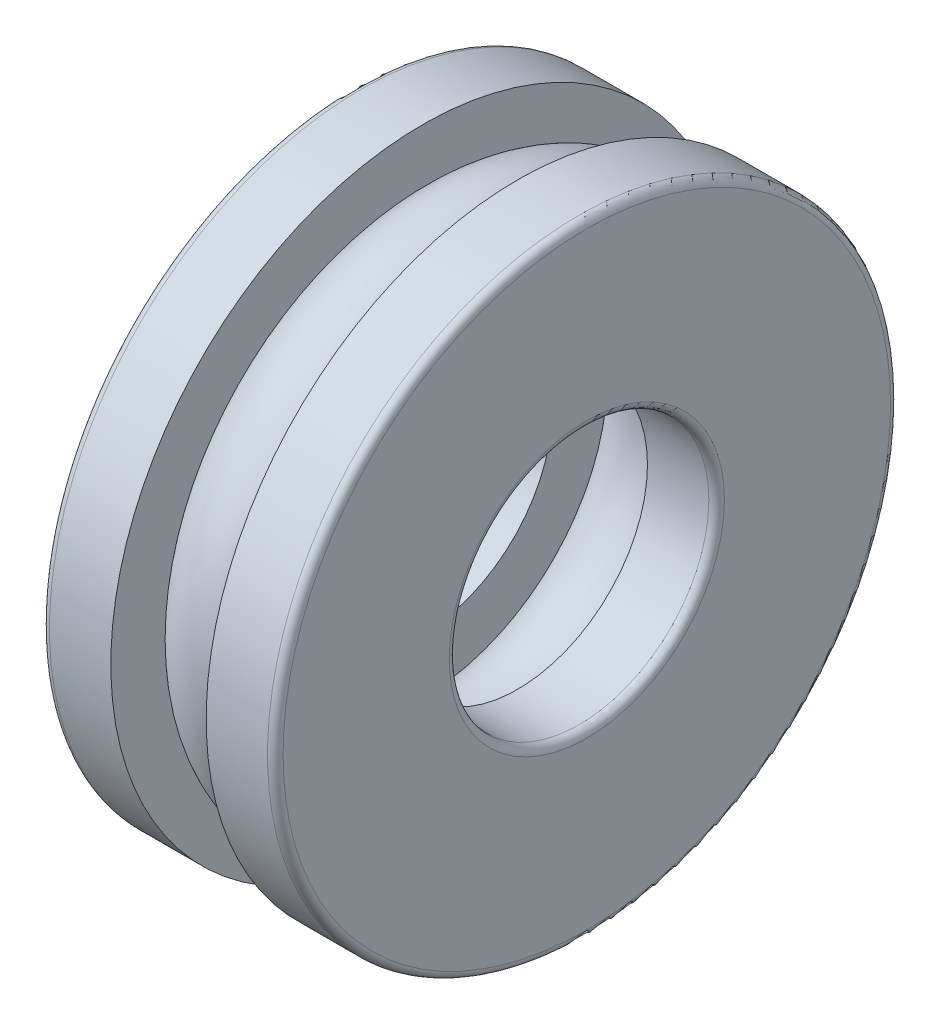
ISO-10303-21;
HEADER;
FILE_DESCRIPTION(('STEP AP214'),'2;1');
FILE_NAME('part.step','',(''),(''),'','','');
FILE_SCHEMA(('AUTOMOTIVE_DESIGN { 1 0 10303 214 1 1 1 1 }'));
ENDSEC;
DATA;
#1=APPLICATION_CONTEXT('core data for automotive mechanical design processes');
#2=APPLICATION_PROTOCOL_DEFINITION('international standard','automotive_design',2000,#1);
#3=PRODUCT_CONTEXT('',#1,'mechanical');
#4=PRODUCT('Part','Part','',(#3));
#5=PRODUCT_RELATED_PRODUCT_CATEGORY('part','',(#4));
#6=PRODUCT_DEFINITION_FORMATION('','',#4);
#7=PRODUCT_DEFINITION_CONTEXT('part definition',#1,'design');
#8=PRODUCT_DEFINITION('design','',#6,#7);
#9=PRODUCT_DEFINITION_SHAPE('','',#8);
#10=(LENGTH_UNIT() NAMED_UNIT(*) SI_UNIT(.MILLI.,.METRE.));
#11=(NAMED_UNIT(*) PLANE_ANGLE_UNIT() SI_UNIT($,.RADIAN.));
#12=(NAMED_UNIT(*) SI_UNIT($,.STERADIAN.) SOLID_ANGLE_UNIT());
#13=UNCERTAINTY_MEASURE_WITH_UNIT(LENGTH_MEASURE(1.E-05),#10,'distance_accuracy_value','');
#14=(GEOMETRIC_REPRESENTATION_CONTEXT(3) GLOBAL_UNCERTAINTY_ASSIGNED_CONTEXT((#13)) GLOBAL_UNIT_ASSIGNED_CONTEXT((#10,
#11,#12)) REPRESENTATION_CONTEXT('',''));
#15=CARTESIAN_POINT('',(0.,0.,0.));
#16=DIRECTION('',(0.,0.,1.));
#17=DIRECTION('',(1.,0.,0.));
#18=AXIS2_PLACEMENT_3D('',#15,#16,#17);
#19=CARTESIAN_POINT('',(0.,0.,0.));
#20=DIRECTION('',(-1.,0.,0.));
#21=DIRECTION('',(0.,0.,1.));
#22=AXIS2_PLACEMENT_3D('',#19,#20,#21);
#23=TOROIDAL_SURFACE('',#22,8.5,2.295);
#24=CARTESIAN_POINT('',(1.836,0.,0.));
#25=DIRECTION('',(-1.,0.,0.));
#26=DIRECTION('',(0.,0.,1.));
#27=AXIS2_PLACEMENT_3D('',#24,#25,#26);
#28=CIRCLE('',#27,9.877);
#29=CARTESIAN_POINT('',(1.836,0.,9.877));
#30=VERTEX_POINT('',#29);
#31=EDGE_CURVE('E35',#30,#30,#28,.T.);
#32=ORIENTED_EDGE('',*,*,#31,.T.);
#33=EDGE_LOOP('',(#32));
#34=FACE_BOUND('',#33,.T.);
#35=CARTESIAN_POINT('',(-1.836,0.,0.));
#36=DIRECTION('',(1.,0.,0.));
#37=DIRECTION('',(0.,0.,-1.));
#38=AXIS2_PLACEMENT_3D('',#35,#36,#37);
#39=CIRCLE('',#38,9.877);
#40=CARTESIAN_POINT('',(-1.836,0.,-9.877));
#41=VERTEX_POINT('',#40);
#42=EDGE_CURVE('E50',#41,#41,#39,.F.);
#43=ORIENTED_EDGE('',*,*,#42,.F.);
#44=EDGE_LOOP('',(#43));
#45=FACE_BOUND('',#44,.T.);
#46=ADVANCED_FACE('F31',(#34,#45),#23,.T.);
#47=CARTESIAN_POINT('',(-1.836,7.16508277410171,0.));
#48=DIRECTION('',(1.,0.,0.));
#49=DIRECTION('',(0.,0.,-1.));
#50=AXIS2_PLACEMENT_3D('',#47,#48,#49);
#51=PLANE('',#50);
#52=CARTESIAN_POINT('',(-1.836,0.,0.));
#53=DIRECTION('',(1.,0.,0.));
#54=DIRECTION('',(0.,0.,-1.));
#55=AXIS2_PLACEMENT_3D('',#52,#53,#54);
#56=CIRCLE('',#55,5.);
#57=CARTESIAN_POINT('',(-1.836,0.,-5.));
#58=VERTEX_POINT('',#57);
#59=EDGE_CURVE('E69',#58,#58,#56,.T.);
#60=ORIENTED_EDGE('',*,*,#59,.F.);
#61=EDGE_LOOP('',(#60));
#62=FACE_BOUND('',#61,.T.);
#63=CARTESIAN_POINT('',(-1.836,0.,0.));
#64=DIRECTION('',(-1.,0.,0.));
#65=DIRECTION('',(0.,0.,1.));
#66=AXIS2_PLACEMENT_3D('',#63,#64,#65);
#67=CIRCLE('',#66,7.123);
#68=CARTESIAN_POINT('',(-1.836,0.,7.123));
#69=VERTEX_POINT('',#68);
#70=EDGE_CURVE('E48',#69,#69,#67,.F.);
#71=ORIENTED_EDGE('',*,*,#70,.T.);
#72=EDGE_LOOP('',(#71));
#73=FACE_BOUND('',#72,.T.);
#74=ADVANCED_FACE('F98',(#62,#73),#51,.T.);
#75=CARTESIAN_POINT('',(-1.836,12.,0.));
#76=DIRECTION('',(1.,0.,0.));
#77=DIRECTION('',(0.,0.,-1.));
#78=AXIS2_PLACEMENT_3D('',#75,#76,#77);
#79=PLANE('',#78);
#80=ORIENTED_EDGE('',*,*,#42,.T.);
#81=EDGE_LOOP('',(#80));
#82=FACE_BOUND('',#81,.T.);
#83=CARTESIAN_POINT('',(-1.836,0.,0.));
#84=DIRECTION('',(1.,0.,0.));
#85=DIRECTION('',(0.,0.,-1.));
#86=AXIS2_PLACEMENT_3D('',#83,#84,#85);
#87=CIRCLE('',#86,12.);
#88=CARTESIAN_POINT('',(-1.836,0.,-12.));
#89=VERTEX_POINT('',#88);
#90=EDGE_CURVE('E10',#89,#89,#87,.T.);
#91=ORIENTED_EDGE('',*,*,#90,.T.);
#92=EDGE_LOOP('',(#91));
#93=FACE_BOUND('',#92,.T.);
#94=ADVANCED_FACE('F33',(#82,#93),#79,.T.);
#95=CARTESIAN_POINT('',(-34.925,0.,0.));
#96=DIRECTION('',(1.,0.,0.));
#97=DIRECTION('',(0.,0.,-1.));
#98=AXIS2_PLACEMENT_3D('',#95,#96,#97);
#99=CYLINDRICAL_SURFACE('',#98,12.);
#100=CARTESIAN_POINT('',(-4.2,0.,0.));
#101=DIRECTION('',(1.,0.,0.));
#102=DIRECTION('',(0.,0.,-1.));
#103=AXIS2_PLACEMENT_3D('',#100,#101,#102);
#104=CIRCLE('',#103,12.);
#105=CARTESIAN_POINT('',(-4.2,0.,-12.));
#106=VERTEX_POINT('',#105);
#107=EDGE_CURVE('E39',#106,#106,#104,.T.);
#108=ORIENTED_EDGE('',*,*,#107,.T.);
#109=EDGE_LOOP('',(#108));
#110=FACE_BOUND('',#109,.T.);
#111=ORIENTED_EDGE('',*,*,#90,.F.);
#112=EDGE_LOOP('',(#111));
#113=FACE_BOUND('',#112,.T.);
#114=ADVANCED_FACE('F95',(#110,#113),#99,.T.);
#115=CARTESIAN_POINT('',(-4.2,0.,0.));
#116=DIRECTION('',(1.,0.,0.));
#117=DIRECTION('',(0.,0.,-1.));
#118=AXIS2_PLACEMENT_3D('',#115,#116,#117);
#119=TOROIDAL_SURFACE('',#118,11.7,0.3);
#120=CARTESIAN_POINT('',(-4.5,0.,0.));
#121=DIRECTION('',(1.,0.,0.));
#122=DIRECTION('',(0.,0.,-1.));
#123=AXIS2_PLACEMENT_3D('',#120,#121,#122);
#124=CIRCLE('',#123,11.7);
#125=CARTESIAN_POINT('',(-4.5,0.,-11.7));
#126=VERTEX_POINT('',#125);
#127=EDGE_CURVE('E44',#126,#126,#124,.T.);
#128=ORIENTED_EDGE('',*,*,#127,.T.);
#129=EDGE_LOOP('',(#128));
#130=FACE_BOUND('',#129,.T.);
#131=ORIENTED_EDGE('',*,*,#107,.F.);
#132=EDGE_LOOP('',(#131));
#133=FACE_BOUND('',#132,.T.);
#134=ADVANCED_FACE('F80',(#130,#133),#119,.T.);
#135=CARTESIAN_POINT('',(-4.5,5.3,0.));
#136=DIRECTION('',(-1.,0.,0.));
#137=DIRECTION('',(0.,0.,1.));
#138=AXIS2_PLACEMENT_3D('',#135,#136,#137);
#139=PLANE('',#138);
#140=CARTESIAN_POINT('',(-4.5,0.,0.));
#141=DIRECTION('',(1.,0.,0.));
#142=DIRECTION('',(0.,0.,-1.));
#143=AXIS2_PLACEMENT_3D('',#140,#141,#142);
#144=CIRCLE('',#143,5.3);
#145=CARTESIAN_POINT('',(-4.5,0.,-5.3));
#146=VERTEX_POINT('',#145);
#147=EDGE_CURVE('E75',#146,#146,#144,.T.);
#148=ORIENTED_EDGE('',*,*,#147,.T.);
#149=EDGE_LOOP('',(#148));
#150=FACE_BOUND('',#149,.T.);
#151=ORIENTED_EDGE('',*,*,#127,.F.);
#152=EDGE_LOOP('',(#151));
#153=FACE_BOUND('',#152,.T.);
#154=ADVANCED_FACE('F83',(#150,#153),#139,.T.);
#155=CARTESIAN_POINT('',(-4.2,0.,0.));
#156=DIRECTION('',(1.,0.,0.));
#157=DIRECTION('',(0.,0.,-1.));
#158=AXIS2_PLACEMENT_3D('',#155,#156,#157);
#159=TOROIDAL_SURFACE('',#158,5.3,0.3);
#160=CARTESIAN_POINT('',(-4.2,0.,0.));
#161=DIRECTION('',(1.,0.,0.));
#162=DIRECTION('',(0.,0.,-1.));
#163=AXIS2_PLACEMENT_3D('',#160,#161,#162);
#164=CIRCLE('',#163,5.);
#165=CARTESIAN_POINT('',(-4.2,0.,-5.));
#166=VERTEX_POINT('',#165);
#167=EDGE_CURVE('E72',#166,#166,#164,.T.);
#168=ORIENTED_EDGE('',*,*,#167,.T.);
#169=EDGE_LOOP('',(#168));
#170=FACE_BOUND('',#169,.T.);
#171=ORIENTED_EDGE('',*,*,#147,.F.);
#172=EDGE_LOOP('',(#171));
#173=FACE_BOUND('',#172,.T.);
#174=ADVANCED_FACE('F85',(#170,#173),#159,.T.);
#175=CARTESIAN_POINT('',(-34.925,0.,0.));
#176=DIRECTION('',(1.,0.,0.));
#177=DIRECTION('',(0.,0.,-1.));
#178=AXIS2_PLACEMENT_3D('',#175,#176,#177);
#179=CYLINDRICAL_SURFACE('',#178,5.);
#180=ORIENTED_EDGE('',*,*,#59,.T.);
#181=EDGE_LOOP('',(#180));
#182=FACE_BOUND('',#181,.T.);
#183=ORIENTED_EDGE('',*,*,#167,.F.);
#184=EDGE_LOOP('',(#183));
#185=FACE_BOUND('',#184,.T.);
#186=ADVANCED_FACE('F92',(#182,#185),#179,.F.);
#187=CARTESIAN_POINT('',(1.836,0.,0.));
#188=DIRECTION('',(1.,0.,0.));
#189=DIRECTION('',(0.,0.,-1.));
#190=AXIS2_PLACEMENT_3D('',#187,#188,#189);
#191=CIRCLE('',#190,7.123);
#192=CARTESIAN_POINT('',(1.836,0.,-7.123));
#193=VERTEX_POINT('',#192);
#194=EDGE_CURVE('E51',#193,#193,#191,.T.);
#195=ORIENTED_EDGE('',*,*,#194,.T.);
#196=EDGE_LOOP('',(#195));
#197=FACE_BOUND('',#196,.T.);
#198=ORIENTED_EDGE('',*,*,#70,.F.);
#199=EDGE_LOOP('',(#198));
#200=FACE_BOUND('',#199,.T.);
#201=ADVANCED_FACE('F101',(#197,#200),#23,.T.);
#202=CARTESIAN_POINT('',(1.836,7.16508277410171,0.));
#203=DIRECTION('',(-1.,0.,0.));
#204=DIRECTION('',(0.,0.,-1.));
#205=AXIS2_PLACEMENT_3D('',#202,#203,#204);
#206=PLANE('',#205);
#207=CARTESIAN_POINT('',(1.836,0.,0.));
#208=DIRECTION('',(1.,0.,0.));
#209=DIRECTION('',(0.,0.,-1.));
#210=AXIS2_PLACEMENT_3D('',#207,#208,#209);
#211=CIRCLE('',#210,5.);
#212=CARTESIAN_POINT('',(1.836,0.,-5.));
#213=VERTEX_POINT('',#212);
#214=EDGE_CURVE('E245',#213,#213,#211,.T.);
#215=ORIENTED_EDGE('',*,*,#214,.T.);
#216=EDGE_LOOP('',(#215));
#217=FACE_BOUND('',#216,.T.);
#218=ORIENTED_EDGE('',*,*,#194,.F.);
#219=EDGE_LOOP('',(#218));
#220=FACE_BOUND('',#219,.T.);
#221=ADVANCED_FACE('F110',(#217,#220),#206,.T.);
#222=CARTESIAN_POINT('',(1.836,12.,0.));
#223=DIRECTION('',(-1.,0.,0.));
#224=DIRECTION('',(0.,0.,-1.));
#225=AXIS2_PLACEMENT_3D('',#222,#223,#224);
#226=PLANE('',#225);
#227=ORIENTED_EDGE('',*,*,#31,.F.);
#228=EDGE_LOOP('',(#227));
#229=FACE_BOUND('',#228,.T.);
#230=CARTESIAN_POINT('',(1.836,0.,0.));
#231=DIRECTION('',(1.,0.,0.));
#232=DIRECTION('',(0.,0.,-1.));
#233=AXIS2_PLACEMENT_3D('',#230,#231,#232);
#234=CIRCLE('',#233,12.);
#235=CARTESIAN_POINT('',(1.836,0.,-12.));
#236=VERTEX_POINT('',#235);
#237=EDGE_CURVE('E53',#236,#236,#234,.T.);
#238=ORIENTED_EDGE('',*,*,#237,.F.);
#239=EDGE_LOOP('',(#238));
#240=FACE_BOUND('',#239,.T.);
#241=ADVANCED_FACE('F115',(#229,#240),#226,.T.);
#242=CARTESIAN_POINT('',(34.925,0.,0.));
#243=DIRECTION('',(-1.,0.,0.));
#244=DIRECTION('',(0.,0.,-1.));
#245=AXIS2_PLACEMENT_3D('',#242,#243,#244);
#246=CYLINDRICAL_SURFACE('',#245,12.);
#247=CARTESIAN_POINT('',(4.2,0.,0.));
#248=DIRECTION('',(1.,0.,0.));
#249=DIRECTION('',(0.,0.,-1.));
#250=AXIS2_PLACEMENT_3D('',#247,#248,#249);
#251=CIRCLE('',#250,12.);
#252=CARTESIAN_POINT('',(4.2,0.,-12.));
#253=VERTEX_POINT('',#252);
#254=EDGE_CURVE('E58',#253,#253,#251,.T.);
#255=ORIENTED_EDGE('',*,*,#254,.F.);
#256=EDGE_LOOP('',(#255));
#257=FACE_BOUND('',#256,.T.);
#258=ORIENTED_EDGE('',*,*,#237,.T.);
#259=EDGE_LOOP('',(#258));
#260=FACE_BOUND('',#259,.T.);
#261=ADVANCED_FACE('F189',(#257,#260),#246,.T.);
#262=CARTESIAN_POINT('',(4.2,0.,0.));
#263=DIRECTION('',(-1.,0.,0.));
#264=DIRECTION('',(0.,0.,-1.));
#265=AXIS2_PLACEMENT_3D('',#262,#263,#264);
#266=TOROIDAL_SURFACE('',#265,11.7,0.3);
#267=CARTESIAN_POINT('',(4.5,0.,0.));
#268=DIRECTION('',(1.,0.,0.));
#269=DIRECTION('',(0.,0.,-1.));
#270=AXIS2_PLACEMENT_3D('',#267,#268,#269);
#271=CIRCLE('',#270,11.7);
#272=CARTESIAN_POINT('',(4.5,0.,-11.7));
#273=VERTEX_POINT('',#272);
#274=EDGE_CURVE('E63',#273,#273,#271,.T.);
#275=ORIENTED_EDGE('',*,*,#274,.F.);
#276=EDGE_LOOP('',(#275));
#277=FACE_BOUND('',#276,.T.);
#278=ORIENTED_EDGE('',*,*,#254,.T.);
#279=EDGE_LOOP('',(#278));
#280=FACE_BOUND('',#279,.T.);
#281=ADVANCED_FACE('F197',(#277,#280),#266,.T.);
#282=CARTESIAN_POINT('',(4.5,5.3,0.));
#283=DIRECTION('',(1.,0.,0.));
#284=DIRECTION('',(0.,0.,1.));
#285=AXIS2_PLACEMENT_3D('',#282,#283,#284);
#286=PLANE('',#285);
#287=CARTESIAN_POINT('',(4.5,0.,0.));
#288=DIRECTION('',(1.,0.,0.));
#289=DIRECTION('',(0.,0.,-1.));
#290=AXIS2_PLACEMENT_3D('',#287,#288,#289);
#291=CIRCLE('',#290,5.3);
#292=CARTESIAN_POINT('',(4.5,0.,-5.3));
#293=VERTEX_POINT('',#292);
#294=EDGE_CURVE('E249',#293,#293,#291,.T.);
#295=ORIENTED_EDGE('',*,*,#294,.F.);
#296=EDGE_LOOP('',(#295));
#297=FACE_BOUND('',#296,.T.);
#298=ORIENTED_EDGE('',*,*,#274,.T.);
#299=EDGE_LOOP('',(#298));
#300=FACE_BOUND('',#299,.T.);
#301=ADVANCED_FACE('F206',(#297,#300),#286,.T.);
#302=CARTESIAN_POINT('',(4.2,0.,0.));
#303=DIRECTION('',(-1.,0.,0.));
#304=DIRECTION('',(0.,0.,-1.));
#305=AXIS2_PLACEMENT_3D('',#302,#303,#304);
#306=TOROIDAL_SURFACE('',#305,5.3,0.3);
#307=CARTESIAN_POINT('',(4.2,0.,0.));
#308=DIRECTION('',(1.,0.,0.));
#309=DIRECTION('',(0.,0.,-1.));
#310=AXIS2_PLACEMENT_3D('',#307,#308,#309);
#311=CIRCLE('',#310,5.);
#312=CARTESIAN_POINT('',(4.2,0.,-5.));
#313=VERTEX_POINT('',#312);
#314=EDGE_CURVE('E248',#313,#313,#311,.T.);
#315=ORIENTED_EDGE('',*,*,#314,.F.);
#316=EDGE_LOOP('',(#315));
#317=FACE_BOUND('',#316,.T.);
#318=ORIENTED_EDGE('',*,*,#294,.T.);
#319=EDGE_LOOP('',(#318));
#320=FACE_BOUND('',#319,.T.);
#321=ADVANCED_FACE('F215',(#317,#320),#306,.T.);
#322=CARTESIAN_POINT('',(34.925,0.,0.));
#323=DIRECTION('',(-1.,0.,0.));
#324=DIRECTION('',(0.,0.,-1.));
#325=AXIS2_PLACEMENT_3D('',#322,#323,#324);
#326=CYLINDRICAL_SURFACE('',#325,5.);
#327=ORIENTED_EDGE('',*,*,#214,.F.);
#328=EDGE_LOOP('',(#327));
#329=FACE_BOUND('',#328,.T.);
#330=ORIENTED_EDGE('',*,*,#314,.T.);
#331=EDGE_LOOP('',(#330));
#332=FACE_BOUND('',#331,.T.);
#333=ADVANCED_FACE('F224',(#329,#332),#326,.F.);
#334=CLOSED_SHELL('',(#46,#74,#94,#114,#134,#154,#174,#186,#201,#221,#241,#261,#281,#301,#321,#333));
#335=MANIFOLD_SOLID_BREP('B2',#334);
#336=ADVANCED_BREP_SHAPE_REPRESENTATION('',(#18,#335),#14);
#337=SHAPE_DEFINITION_REPRESENTATION(#9,#336);
ENDSEC;
END-ISO-10303-21;
